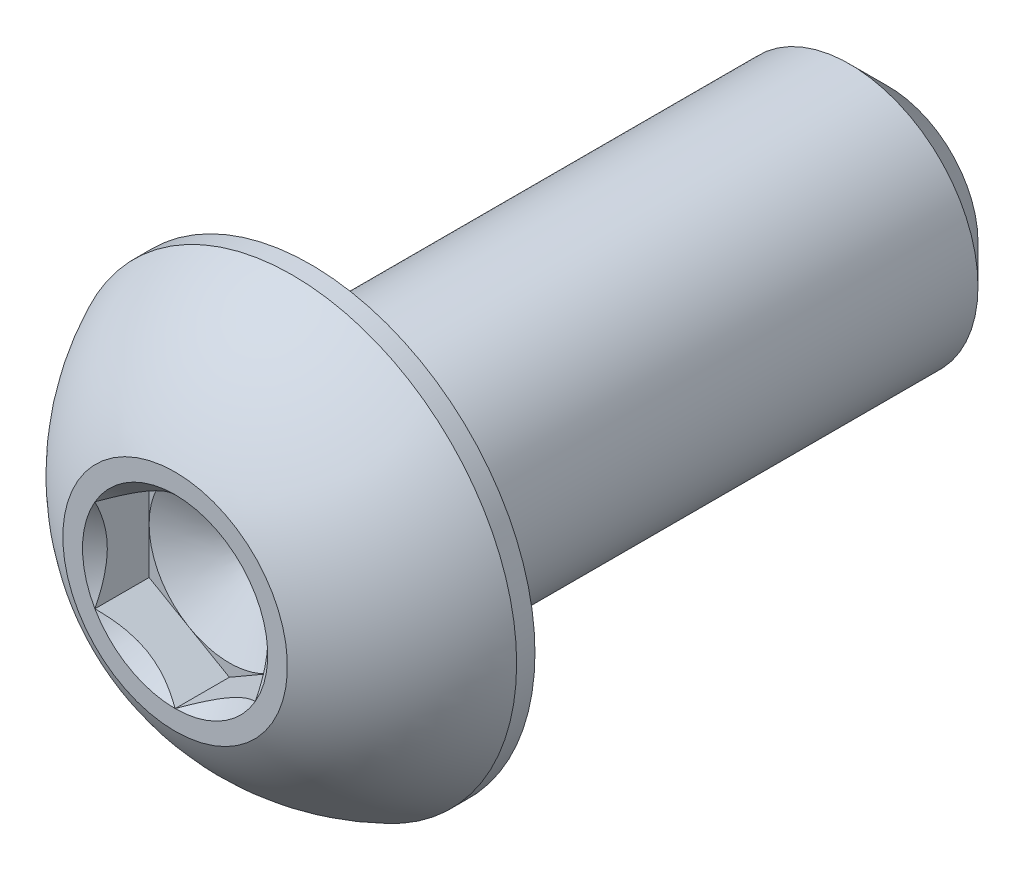
ISO-10303-21;
HEADER;
FILE_DESCRIPTION(('STEP AP214'),'2;1');
FILE_NAME('part.step','',(''),(''),'','','');
FILE_SCHEMA(('AUTOMOTIVE_DESIGN { 1 0 10303 214 1 1 1 1 }'));
ENDSEC;
DATA;
#1=APPLICATION_CONTEXT('core data for automotive mechanical design processes');
#2=APPLICATION_PROTOCOL_DEFINITION('international standard','automotive_design',2000,#1);
#3=PRODUCT_CONTEXT('',#1,'mechanical');
#4=PRODUCT('Part','Part','',(#3));
#5=PRODUCT_RELATED_PRODUCT_CATEGORY('part','',(#4));
#6=PRODUCT_DEFINITION_FORMATION('','',#4);
#7=PRODUCT_DEFINITION_CONTEXT('part definition',#1,'design');
#8=PRODUCT_DEFINITION('design','',#6,#7);
#9=PRODUCT_DEFINITION_SHAPE('','',#8);
#10=(LENGTH_UNIT() NAMED_UNIT(*) SI_UNIT(.MILLI.,.METRE.));
#11=(NAMED_UNIT(*) PLANE_ANGLE_UNIT() SI_UNIT($,.RADIAN.));
#12=(NAMED_UNIT(*) SI_UNIT($,.STERADIAN.) SOLID_ANGLE_UNIT());
#13=UNCERTAINTY_MEASURE_WITH_UNIT(LENGTH_MEASURE(1.E-05),#10,'distance_accuracy_value','');
#14=(GEOMETRIC_REPRESENTATION_CONTEXT(3) GLOBAL_UNCERTAINTY_ASSIGNED_CONTEXT((#13)) GLOBAL_UNIT_ASSIGNED_CONTEXT((#10,
#11,#12)) REPRESENTATION_CONTEXT('',''));
#15=CARTESIAN_POINT('',(0.,0.,0.));
#16=DIRECTION('',(0.,0.,1.));
#17=DIRECTION('',(1.,0.,0.));
#18=AXIS2_PLACEMENT_3D('',#15,#16,#17);
#19=CARTESIAN_POINT('',(0.,1.984375,8.82015));
#20=DIRECTION('',(0.,0.,-1.));
#21=DIRECTION('',(-1.,0.,0.));
#22=AXIS2_PLACEMENT_3D('',#19,#20,#21);
#23=PLANE('',#22);
#24=CARTESIAN_POINT('',(0.,0.,8.82015));
#25=DIRECTION('',(0.,0.,1.));
#26=DIRECTION('',(1.,0.,0.));
#27=AXIS2_PLACEMENT_3D('',#24,#25,#26);
#28=CIRCLE('',#27,2.778125);
#29=CARTESIAN_POINT('',(0.,2.778125,8.82015));
#30=VERTEX_POINT('',#29);
#31=EDGE_CURVE('E166',#30,#30,#28,.T.);
#32=ORIENTED_EDGE('',*,*,#31,.T.);
#33=EDGE_LOOP('',(#32));
#34=FACE_BOUND('',#33,.T.);
#35=CARTESIAN_POINT('',(0.,0.,8.82015));
#36=DIRECTION('',(0.,0.,1.));
#37=DIRECTION('',(1.,0.,0.));
#38=AXIS2_PLACEMENT_3D('',#35,#36,#37);
#39=CIRCLE('',#38,2.29135888084633);
#40=CARTESIAN_POINT('',(0.,2.29135888084633,8.82015));
#41=VERTEX_POINT('',#40);
#42=CARTESIAN_POINT('',(-1.984375,1.14567944042316,8.82015));
#43=VERTEX_POINT('',#42);
#44=EDGE_CURVE('E120',#41,#43,#39,.T.);
#45=ORIENTED_EDGE('',*,*,#44,.F.);
#46=CARTESIAN_POINT('',(0.,0.,8.82015));
#47=DIRECTION('',(0.,0.,1.));
#48=DIRECTION('',(1.,0.,0.));
#49=AXIS2_PLACEMENT_3D('',#46,#47,#48);
#50=CIRCLE('',#49,2.29135888084633);
#51=CARTESIAN_POINT('',(1.984375,1.14567944042316,8.82015));
#52=VERTEX_POINT('',#51);
#53=EDGE_CURVE('E105',#52,#41,#50,.T.);
#54=ORIENTED_EDGE('',*,*,#53,.F.);
#55=CARTESIAN_POINT('',(0.,0.,8.82015));
#56=DIRECTION('',(0.,0.,1.));
#57=DIRECTION('',(1.,0.,0.));
#58=AXIS2_PLACEMENT_3D('',#55,#56,#57);
#59=CIRCLE('',#58,2.29135888084633);
#60=CARTESIAN_POINT('',(1.984375,-1.14567944042316,8.82015));
#61=VERTEX_POINT('',#60);
#62=EDGE_CURVE('E116',#61,#52,#59,.T.);
#63=ORIENTED_EDGE('',*,*,#62,.F.);
#64=CARTESIAN_POINT('',(0.,0.,8.82015));
#65=DIRECTION('',(0.,0.,1.));
#66=DIRECTION('',(1.,0.,0.));
#67=AXIS2_PLACEMENT_3D('',#64,#65,#66);
#68=CIRCLE('',#67,2.29135888084633);
#69=CARTESIAN_POINT('',(0.,-2.29135888084633,8.82015));
#70=VERTEX_POINT('',#69);
#71=EDGE_CURVE('E137',#70,#61,#68,.T.);
#72=ORIENTED_EDGE('',*,*,#71,.F.);
#73=CARTESIAN_POINT('',(0.,0.,8.82015));
#74=DIRECTION('',(0.,0.,1.));
#75=DIRECTION('',(1.,0.,0.));
#76=AXIS2_PLACEMENT_3D('',#73,#74,#75);
#77=CIRCLE('',#76,2.29135888084633);
#78=CARTESIAN_POINT('',(-1.984375,-1.14567944042317,8.82015));
#79=VERTEX_POINT('',#78);
#80=EDGE_CURVE('E437',#79,#70,#77,.T.);
#81=ORIENTED_EDGE('',*,*,#80,.F.);
#82=CARTESIAN_POINT('',(0.,0.,8.82015));
#83=DIRECTION('',(0.,0.,1.));
#84=DIRECTION('',(1.,0.,0.));
#85=AXIS2_PLACEMENT_3D('',#82,#83,#84);
#86=CIRCLE('',#85,2.29135888084633);
#87=EDGE_CURVE('E446',#43,#79,#86,.T.);
#88=ORIENTED_EDGE('',*,*,#87,.F.);
#89=EDGE_LOOP('',(#45,#54,#63,#72,#81,#88));
#90=FACE_BOUND('',#89,.T.);
#91=ADVANCED_FACE('F32',(#34,#90),#23,.F.);
#92=CARTESIAN_POINT('',(0.,0.,-8.82015));
#93=DIRECTION('',(0.,0.,1.));
#94=DIRECTION('',(1.,0.,0.));
#95=AXIS2_PLACEMENT_3D('',#92,#93,#94);
#96=CONICAL_SURFACE('',#95,2.2225,0.785398163397446);
#97=CARTESIAN_POINT('',(0.,0.,-7.86765));
#98=DIRECTION('',(0.,0.,1.));
#99=DIRECTION('',(1.,0.,0.));
#100=AXIS2_PLACEMENT_3D('',#97,#98,#99);
#101=CIRCLE('',#100,3.175);
#102=CARTESIAN_POINT('',(3.175,0.,-7.86765));
#103=VERTEX_POINT('',#102);
#104=EDGE_CURVE('E11',#103,#103,#101,.T.);
#105=ORIENTED_EDGE('',*,*,#104,.F.);
#106=EDGE_LOOP('',(#105));
#107=FACE_BOUND('',#106,.T.);
#108=CARTESIAN_POINT('',(0.,0.,-8.82015));
#109=DIRECTION('',(0.,0.,1.));
#110=DIRECTION('',(1.,0.,0.));
#111=AXIS2_PLACEMENT_3D('',#108,#109,#110);
#112=CIRCLE('',#111,2.2225);
#113=CARTESIAN_POINT('',(2.2225,0.,-8.82015));
#114=VERTEX_POINT('',#113);
#115=EDGE_CURVE('E159',#114,#114,#112,.T.);
#116=ORIENTED_EDGE('',*,*,#115,.T.);
#117=EDGE_LOOP('',(#116));
#118=FACE_BOUND('',#117,.T.);
#119=ADVANCED_FACE('F34',(#107,#118),#96,.T.);
#120=CARTESIAN_POINT('',(0.,0.,8.82015));
#121=DIRECTION('',(0.,0.,1.));
#122=DIRECTION('',(1.,0.,0.));
#123=AXIS2_PLACEMENT_3D('',#120,#121,#122);
#124=CYLINDRICAL_SURFACE('',#123,3.175);
#125=CARTESIAN_POINT('',(0.,0.,5.46735));
#126=DIRECTION('',(0.,0.,1.));
#127=DIRECTION('',(1.,0.,0.));
#128=AXIS2_PLACEMENT_3D('',#125,#126,#127);
#129=CIRCLE('',#128,3.175);
#130=CARTESIAN_POINT('',(3.175,0.,5.46735));
#131=VERTEX_POINT('',#130);
#132=EDGE_CURVE('E40',#131,#131,#129,.T.);
#133=ORIENTED_EDGE('',*,*,#132,.F.);
#134=EDGE_LOOP('',(#133));
#135=FACE_BOUND('',#134,.T.);
#136=ORIENTED_EDGE('',*,*,#104,.T.);
#137=EDGE_LOOP('',(#136));
#138=FACE_BOUND('',#137,.T.);
#139=ADVANCED_FACE('F180',(#135,#138),#124,.T.);
#140=CARTESIAN_POINT('',(0.,5.5499,5.46735));
#141=DIRECTION('',(0.,0.,1.));
#142=DIRECTION('',(1.,0.,0.));
#143=AXIS2_PLACEMENT_3D('',#140,#141,#142);
#144=PLANE('',#143);
#145=CARTESIAN_POINT('',(0.,0.,5.46735));
#146=DIRECTION('',(0.,0.,1.));
#147=DIRECTION('',(1.,0.,0.));
#148=AXIS2_PLACEMENT_3D('',#145,#146,#147);
#149=CIRCLE('',#148,5.5499);
#150=CARTESIAN_POINT('',(5.5499,0.,5.46735));
#151=VERTEX_POINT('',#150);
#152=EDGE_CURVE('E173',#151,#151,#149,.T.);
#153=ORIENTED_EDGE('',*,*,#152,.F.);
#154=EDGE_LOOP('',(#153));
#155=FACE_BOUND('',#154,.T.);
#156=ORIENTED_EDGE('',*,*,#132,.T.);
#157=EDGE_LOOP('',(#156));
#158=FACE_BOUND('',#157,.T.);
#159=ADVANCED_FACE('F178',(#155,#158),#144,.F.);
#160=CARTESIAN_POINT('',(0.,0.,8.82015));
#161=DIRECTION('',(0.,0.,1.));
#162=DIRECTION('',(1.,0.,0.));
#163=AXIS2_PLACEMENT_3D('',#160,#161,#162);
#164=CYLINDRICAL_SURFACE('',#163,5.5499);
#165=CARTESIAN_POINT('',(0.,0.,5.92092142857143));
#166=DIRECTION('',(0.,0.,1.));
#167=DIRECTION('',(1.,0.,0.));
#168=AXIS2_PLACEMENT_3D('',#165,#166,#167);
#169=CIRCLE('',#168,5.5499);
#170=CARTESIAN_POINT('',(0.,5.5499,5.92092142857143));
#171=VERTEX_POINT('',#170);
#172=EDGE_CURVE('E170',#171,#171,#169,.T.);
#173=ORIENTED_EDGE('',*,*,#172,.F.);
#174=EDGE_LOOP('',(#173));
#175=FACE_BOUND('',#174,.T.);
#176=ORIENTED_EDGE('',*,*,#152,.T.);
#177=EDGE_LOOP('',(#176));
#178=FACE_BOUND('',#177,.T.);
#179=ADVANCED_FACE('F199',(#175,#178),#164,.T.);
#180=CARTESIAN_POINT('',(0.,0.,3.38957820685455));
#181=DIRECTION('',(0.,0.,1.));
#182=DIRECTION('',(0.,1.,0.));
#183=AXIS2_PLACEMENT_3D('',#180,#181,#182);
#184=SPHERICAL_SURFACE('',#183,6.09992528775001);
#185=CARTESIAN_POINT('',(0.,2.778125,8.82015));
#186=CARTESIAN_POINT('',(0.,2.81602671338564,8.80076064772217));
#187=CARTESIAN_POINT('',(0.,2.85372537445918,8.78097438218914));
#188=CARTESIAN_POINT('',(0.,2.92870021164798,8.7406169699155));
#189=CARTESIAN_POINT('',(0.,2.96597638776324,8.72004582317489));
#190=CARTESIAN_POINT('',(0.,3.04008987470139,8.67812759378889));
#191=CARTESIAN_POINT('',(0.,3.07692718552427,8.65678051114351));
#192=CARTESIAN_POINT('',(0.,3.15014680356086,8.61331978760221));
#193=CARTESIAN_POINT('',(0.,3.18652911077458,8.5912061467063));
#194=CARTESIAN_POINT('',(0.,3.25882276944387,8.54622199565968));
#195=CARTESIAN_POINT('',(0.,3.29473412089945,8.52335148550896));
#196=CARTESIAN_POINT('',(0.,3.36607012592493,8.47686362336544));
#197=CARTESIAN_POINT('',(0.,3.40149477949484,8.45324627137262));
#198=CARTESIAN_POINT('',(0.,3.47184185902622,8.40527507858578));
#199=CARTESIAN_POINT('',(0.,3.50676428498768,8.38092123779175));
#200=CARTESIAN_POINT('',(0.,3.57609160000261,8.33148774378183));
#201=CARTESIAN_POINT('',(0.,3.61049648905608,8.30640809056595));
#202=CARTESIAN_POINT('',(0.,3.67877364776563,8.25553396614725));
#203=CARTESIAN_POINT('',(0.,3.71264591742172,8.22973949494445));
#204=CARTESIAN_POINT('',(0.,3.77984298835613,8.17744704238411));
#205=CARTESIAN_POINT('',(0.,3.81316778963445,8.15094906102658));
#206=CARTESIAN_POINT('',(0.,3.87925531482814,8.09726120438586));
#207=CARTESIAN_POINT('',(0.,3.91201803874352,8.07007132910267));
#208=CARTESIAN_POINT('',(0.,3.97696704663191,8.01501160415578));
#209=CARTESIAN_POINT('',(0.,4.00915333060493,7.98714175449209));
#210=CARTESIAN_POINT('',(0.,4.07293534872958,7.93073429841706));
#211=CARTESIAN_POINT('',(0.,4.10453108288122,7.90219669200573));
#212=CARTESIAN_POINT('',(0.,4.16711815037044,7.84446623280081));
#213=CARTESIAN_POINT('',(0.,4.19810948370803,7.81527338000723));
#214=CARTESIAN_POINT('',(0.,4.25947416353471,7.75624522565121));
#215=CARTESIAN_POINT('',(0.,4.28984751002382,7.72640992408876));
#216=CARTESIAN_POINT('',(0.,4.34996290103328,7.66610995144623));
#217=CARTESIAN_POINT('',(0.,4.37970494555363,7.63564528036614));
#218=CARTESIAN_POINT('',(0.,4.43854469425657,7.57409992384361));
#219=CARTESIAN_POINT('',(0.,4.46764239843916,7.54301923840117));
#220=CARTESIAN_POINT('',(0.,4.52518071056457,7.48025547835869));
#221=CARTESIAN_POINT('',(0.,4.55362131850739,7.44857240375865));
#222=CARTESIAN_POINT('',(0.,4.60983297031029,7.38461775468213));
#223=CARTESIAN_POINT('',(0.,4.63760401417036,7.35234618020565));
#224=CARTESIAN_POINT('',(0.,4.6924643634894,7.28722867864499));
#225=CARTESIAN_POINT('',(0.,4.71955366894839,7.25438275156081));
#226=CARTESIAN_POINT('',(0.,4.77303866600855,7.18813094383918));
#227=CARTESIAN_POINT('',(0.,4.79943435760973,7.15472506320173));
#228=CARTESIAN_POINT('',(0.,4.85152055556542,7.08736799290146));
#229=CARTESIAN_POINT('',(0.,4.87721106191992,7.05341680323865));
#230=CARTESIAN_POINT('',(0.,4.927875627133,6.98498399846878));
#231=CARTESIAN_POINT('',(0.,4.95284968599158,6.95050238336172));
#232=CARTESIAN_POINT('',(0.,5.00207040804361,6.88102384381449));
#233=CARTESIAN_POINT('',(0.,5.02631707123706,6.84602691937432));
#234=CARTESIAN_POINT('',(0.,5.0740723726572,6.77553310316971));
#235=CARTESIAN_POINT('',(0.,5.09758101088389,6.74003621140527));
#236=CARTESIAN_POINT('',(0.,5.1438499566405,6.6685580217543));
#237=CARTESIAN_POINT('',(0.,5.16661026417041,6.63257672386778));
#238=CARTESIAN_POINT('',(0.,5.21137257072764,6.56014549546688));
#239=CARTESIAN_POINT('',(0.,5.23337456975495,6.5236955649525));
#240=CARTESIAN_POINT('',(0.,5.276610614416,6.45034305046432));
#241=CARTESIAN_POINT('',(0.,5.29784466004975,6.41344046649051));
#242=CARTESIAN_POINT('',(0.,5.33953548787471,6.33919882181283));
#243=CARTESIAN_POINT('',(0.,5.35999227006592,6.30185976110895));
#244=CARTESIAN_POINT('',(0.,5.40011960846765,6.22676153430598));
#245=CARTESIAN_POINT('',(0.,5.41979016467818,6.18900236820688));
#246=CARTESIAN_POINT('',(0.,5.45833640797136,6.11308047394067));
#247=CARTESIAN_POINT('',(0.,5.47721209505402,6.07491774577356));
#248=CARTESIAN_POINT('',(0.,5.5141603997322,5.99820549304741));
#249=CARTESIAN_POINT('',(0.,5.53223301732771,5.95965596848837));
#250=CARTESIAN_POINT('',(0.,5.5499,5.92092142857143));
#251=B_SPLINE_CURVE_WITH_KNOTS('',3,(#185,#186,#187,#188,#189,#190,#191,#192,#193,#194,#195,
#196,#197,#198,#199,#200,#201,#202,#203,#204,#205,#206,#207,#208,#209,#210,#211,#212,#213,#214,
#215,#216,#217,#218,#219,#220,#221,#222,#223,#224,#225,#226,#227,#228,#229,#230,#231,#232,#233,
#234,#235,#236,#237,#238,#239,#240,#241,#242,#243,#244,#245,#246,#247,#248,#249,#250),
.UNSPECIFIED.,.F.,.F.,(4,2,2,2,2,2,2,2,2,2,2,2,2,2,2,2,2,2,2,2,2,2,2,2,2,2,2,2,2,2,2,2,4),(0.,
0.127717597491554,0.255435194983107,0.383152792474663,0.510870389966216,0.638587987457771,
0.766305584949325,0.894023182440879,1.02174077993243,1.14945837742399,1.27717597491554,
1.4048935724071,1.53261116989865,1.6603287673902,1.78804636488176,1.91576396237331,
2.04348155986487,2.17119915735642,2.29891675484797,2.42663435233953,2.55435194983108,
2.68206954732263,2.80978714481419,2.93750474230574,3.0652223397973,3.19293993728885,
3.32065753478041,3.44837513227196,3.57609272976351,3.70381032725507,3.83152792474662,
3.95924552223818,4.08696311972973),.UNSPECIFIED.);
#252=EDGE_CURVE('BSEAM191',#30,#171,#251,.T.);
#253=ORIENTED_EDGE('',*,*,#31,.F.);
#254=ORIENTED_EDGE('',*,*,#172,.T.);
#255=ORIENTED_EDGE('',*,*,#252,.T.);
#256=ORIENTED_EDGE('',*,*,#252,.F.);
#257=EDGE_LOOP('',(#253,#255,#254,#256));
#258=FACE_BOUND('',#257,.T.);
#259=ADVANCED_FACE('F191',(#258),#184,.T.);
#260=CARTESIAN_POINT('',(0.,2.2225,-8.82015));
#261=DIRECTION('',(0.,0.,1.));
#262=DIRECTION('',(1.,0.,0.));
#263=AXIS2_PLACEMENT_3D('',#260,#261,#262);
#264=PLANE('',#263);
#265=ORIENTED_EDGE('',*,*,#115,.F.);
#266=EDGE_LOOP('',(#265));
#267=FACE_BOUND('',#266,.T.);
#268=ADVANCED_FACE('F189',(#267),#264,.F.);
#269=CARTESIAN_POINT('',(1.984375,1.14567944042316,8.82015));
#270=DIRECTION('',(-0.499999999999999,-0.866025403784439,0.));
#271=DIRECTION('',(0.866025403784439,-0.499999999999999,0.));
#272=AXIS2_PLACEMENT_3D('',#269,#270,#271);
#273=PLANE('',#272);
#274=CARTESIAN_POINT('',(1.984575,1.14556397036933,8.82026547878184));
#275=CARTESIAN_POINT('',(1.9163590048332,1.18494849354192,8.78091285226391));
#276=CARTESIAN_POINT('',(1.84700231489303,1.22499159714897,8.74387131044618));
#277=CARTESIAN_POINT('',(1.70557619954781,1.30664400291398,8.67604885842332));
#278=CARTESIAN_POINT('',(1.63349332126322,1.34826107209555,8.64530568909175));
#279=CARTESIAN_POINT('',(1.488141602734,1.43217992591557,8.59264188881121));
#280=CARTESIAN_POINT('',(1.41490978751306,1.47446033414663,8.57058887587996));
#281=CARTESIAN_POINT('',(1.26683381740529,1.55995203534886,8.53661149294388));
#282=CARTESIAN_POINT('',(1.19199418724658,1.60316071596705,8.52466175609173));
#283=CARTESIAN_POINT('',(1.06301458545618,1.6776271237807,8.5138800990819));
#284=CARTESIAN_POINT('',(1.00904128422756,1.7087886237741,8.51228389905907));
#285=CARTESIAN_POINT('',(0.901182881480199,1.77106070163465,8.51497183886529));
#286=CARTESIAN_POINT('',(0.847297817514476,1.80217125782056,8.51925804034046));
#287=CARTESIAN_POINT('',(0.740036461751395,1.86409863044402,8.53346687301352));
#288=CARTESIAN_POINT('',(0.686660807239859,1.89491507894443,8.54339581045227));
#289=CARTESIAN_POINT('',(0.580832482591103,1.95601509066828,8.56834508427454));
#290=CARTESIAN_POINT('',(0.528379742028898,1.9862986945516,8.58336503038949));
#291=CARTESIAN_POINT('',(0.394017661036351,2.06387267818152,8.62795785163567));
#292=CARTESIAN_POINT('',(0.312941642841675,2.11068193911104,8.66089299593833));
#293=CARTESIAN_POINT('',(0.19372669327016,2.17951072233758,8.7164924412022));
#294=CARTESIAN_POINT('',(0.154440075613999,2.20219286161692,8.73602759205186));
#295=CARTESIAN_POINT('',(0.0765946381319467,2.24713694590237,8.7768787381194));
#296=CARTESIAN_POINT('',(0.0380353888983009,2.26939913882716,8.79819363956835));
#297=CARTESIAN_POINT('',(-0.000200000000000698,2.29147435090016,8.82026547878184));
#298=B_SPLINE_CURVE_WITH_KNOTS('',3,(#274,#275,#276,#277,#278,#279,#280,#281,#282,#283,#284,
#285,#286,#287,#288,#289,#290,#291,#292,#293,#294,#295,#296,#297),.UNSPECIFIED.,.F.,.F.,(4,2,2,
2,2,2,2,2,2,2,2,4),(0.,0.264339630306628,0.530219665093695,0.791876416371461,1.05287424418109,
1.239639843932,1.42647091743852,1.61351120244035,1.8005371524754,2.09764209964316,
2.24579179873714,2.39385111134157),.UNSPECIFIED.);
#299=EDGE_CURVE('E102',#52,#41,#298,.T.);
#300=ORIENTED_EDGE('',*,*,#299,.T.);
#301=DIRECTION('',(0.,0.,-1.));
#302=VECTOR('',#301,1.);
#303=CARTESIAN_POINT('',(0.,2.29135888084633,8.82015));
#304=LINE('',#303,#302);
#305=CARTESIAN_POINT('',(0.,2.29135888084633,7.47903));
#306=VERTEX_POINT('',#305);
#307=EDGE_CURVE('E157',#41,#306,#304,.T.);
#308=ORIENTED_EDGE('',*,*,#307,.T.);
#309=DIRECTION('',(-0.866025403784439,0.499999999999999,0.));
#310=VECTOR('',#309,1.);
#311=CARTESIAN_POINT('',(1.984375,1.14567944042316,7.47903));
#312=LINE('',#311,#310);
#313=CARTESIAN_POINT('',(0.992187499999998,1.71851916063475,7.47903));
#314=VERTEX_POINT('',#313);
#315=EDGE_CURVE('E473',#314,#306,#312,.T.);
#316=ORIENTED_EDGE('',*,*,#315,.F.);
#317=CARTESIAN_POINT('',(1.984375,1.14567944042316,7.47903));
#318=VERTEX_POINT('',#317);
#319=EDGE_CURVE('E47',#318,#314,#312,.T.);
#320=ORIENTED_EDGE('',*,*,#319,.F.);
#321=DIRECTION('',(0.,0.,-1.));
#322=VECTOR('',#321,1.);
#323=CARTESIAN_POINT('',(1.984375,1.14567944042316,8.82015));
#324=LINE('',#323,#322);
#325=EDGE_CURVE('E133',#52,#318,#324,.T.);
#326=ORIENTED_EDGE('',*,*,#325,.F.);
#327=EDGE_LOOP('',(#300,#308,#316,#320,#326));
#328=FACE_BOUND('',#327,.T.);
#329=ADVANCED_FACE('F139',(#328),#273,.T.);
#330=CARTESIAN_POINT('',(0.,2.29135888084633,8.82015));
#331=DIRECTION('',(0.5,-0.866025403784438,0.));
#332=DIRECTION('',(0.866025403784438,0.5,0.));
#333=AXIS2_PLACEMENT_3D('',#330,#331,#332);
#334=PLANE('',#333);
#335=CARTESIAN_POINT('',(0.000199999999999143,2.29147435090016,8.82026547878184));
#336=CARTESIAN_POINT('',(-0.068015995166803,2.25208982772757,8.78091285226391));
#337=CARTESIAN_POINT('',(-0.137372685106966,2.21204672412052,8.74387131044618));
#338=CARTESIAN_POINT('',(-0.278798800452188,2.13039431835551,8.67604885842332));
#339=CARTESIAN_POINT('',(-0.350881678736783,2.08877724917394,8.64530568909175));
#340=CARTESIAN_POINT('',(-0.496233397266004,2.00485839535392,8.59264188881121));
#341=CARTESIAN_POINT('',(-0.569465212486939,1.96257798712287,8.57058887587996));
#342=CARTESIAN_POINT('',(-0.717541182594706,1.87708628592063,8.53661149294387));
#343=CARTESIAN_POINT('',(-0.792380812753424,1.83387760530244,8.52466175609173));
#344=CARTESIAN_POINT('',(-0.921360414543815,1.75941119748879,8.5138800990819));
#345=CARTESIAN_POINT('',(-0.975333715772442,1.72824969749539,8.51228389905907));
#346=CARTESIAN_POINT('',(-1.0831921185198,1.66597761963484,8.51497183886529));
#347=CARTESIAN_POINT('',(-1.13707718248552,1.63486706344893,8.51925804034046));
#348=CARTESIAN_POINT('',(-1.2443385382486,1.57293969082547,8.53346687301352));
#349=CARTESIAN_POINT('',(-1.29771419276014,1.54212324232506,8.54339581045227));
#350=CARTESIAN_POINT('',(-1.4035425174089,1.48102323060122,8.56834508427454));
#351=CARTESIAN_POINT('',(-1.4559952579711,1.45073962671789,8.58336503038949));
#352=CARTESIAN_POINT('',(-1.59035733896365,1.37316564308797,8.62795785163567));
#353=CARTESIAN_POINT('',(-1.67143335715832,1.32635638215845,8.66089299593833));
#354=CARTESIAN_POINT('',(-1.79064830672984,1.25752759893191,8.7164924412022));
#355=CARTESIAN_POINT('',(-1.829934924386,1.23484545965257,8.73602759205186));
#356=CARTESIAN_POINT('',(-1.90778036186805,1.18990137536712,8.7768787381194));
#357=CARTESIAN_POINT('',(-1.9463396111017,1.16763918244233,8.79819363956835));
#358=CARTESIAN_POINT('',(-1.984575,1.14556397036932,8.82026547878184));
#359=B_SPLINE_CURVE_WITH_KNOTS('',3,(#335,#336,#337,#338,#339,#340,#341,#342,#343,#344,#345,
#346,#347,#348,#349,#350,#351,#352,#353,#354,#355,#356,#357,#358),.UNSPECIFIED.,.F.,.F.,(4,2,2,
2,2,2,2,2,2,2,2,4),(0.,0.264339630306627,0.530219665093694,0.79187641637146,1.05287424418109,
1.239639843932,1.42647091743852,1.61351120244035,1.8005371524754,2.09764209964316,
2.24579179873714,2.39385111134157),.UNSPECIFIED.);
#360=EDGE_CURVE('E461',#41,#43,#359,.T.);
#361=ORIENTED_EDGE('',*,*,#360,.T.);
#362=DIRECTION('',(0.,0.,-1.));
#363=VECTOR('',#362,1.);
#364=CARTESIAN_POINT('',(-1.984375,1.14567944042316,8.82015));
#365=LINE('',#364,#363);
#366=CARTESIAN_POINT('',(-1.984375,1.14567944042316,7.47903));
#367=VERTEX_POINT('',#366);
#368=EDGE_CURVE('E154',#43,#367,#365,.T.);
#369=ORIENTED_EDGE('',*,*,#368,.T.);
#370=DIRECTION('',(-0.866025403784438,-0.5,0.));
#371=VECTOR('',#370,1.);
#372=CARTESIAN_POINT('',(0.,2.29135888084633,7.47903));
#373=LINE('',#372,#371);
#374=CARTESIAN_POINT('',(-0.9921875,1.71851916063474,7.47903));
#375=VERTEX_POINT('',#374);
#376=EDGE_CURVE('E475',#375,#367,#373,.T.);
#377=ORIENTED_EDGE('',*,*,#376,.F.);
#378=EDGE_CURVE('E476',#306,#375,#373,.T.);
#379=ORIENTED_EDGE('',*,*,#378,.F.);
#380=ORIENTED_EDGE('',*,*,#307,.F.);
#381=EDGE_LOOP('',(#361,#369,#377,#379,#380));
#382=FACE_BOUND('',#381,.T.);
#383=ADVANCED_FACE('F197',(#382),#334,.T.);
#384=CARTESIAN_POINT('',(-1.984375,1.14567944042316,8.82015));
#385=DIRECTION('',(1.,0.,0.));
#386=DIRECTION('',(0.,0.,-1.));
#387=AXIS2_PLACEMENT_3D('',#384,#385,#386);
#388=PLANE('',#387);
#389=CARTESIAN_POINT('',(-1.984375,-2.24664989492636,9.52632008331692));
#390=CARTESIAN_POINT('',(-1.984375,-2.19177035879913,9.48519669928858));
#391=CARTESIAN_POINT('',(-1.984375,-2.1365793309425,9.4444829661326));
#392=CARTESIAN_POINT('',(-1.984375,-2.0254530694156,9.36405486706175));
#393=CARTESIAN_POINT('',(-1.984375,-1.96951764844329,9.3243407602265));
#394=CARTESIAN_POINT('',(-1.984375,-1.85637247000972,9.24580999604986));
#395=CARTESIAN_POINT('',(-1.984375,-1.79915619451492,9.20700268502025));
#396=CARTESIAN_POINT('',(-1.984375,-1.68374612486123,9.13088116655778));
#397=CARTESIAN_POINT('',(-1.984375,-1.62555240093273,9.09356685249807));
#398=CARTESIAN_POINT('',(-1.984375,-1.44283684202776,8.98031794235897));
#399=CARTESIAN_POINT('',(-1.984375,-1.31636516124235,8.90747141910061));
#400=CARTESIAN_POINT('',(-1.984375,-1.05716498260296,8.77446175577765));
#401=CARTESIAN_POINT('',(-1.984375,-0.924459462264122,8.71425591965465));
#402=CARTESIAN_POINT('',(-1.984375,-0.724893074141588,8.64061183961541));
#403=CARTESIAN_POINT('',(-1.984375,-0.660907572248813,8.61941291748557));
#404=CARTESIAN_POINT('',(-1.984375,-0.531425551080247,8.58215711479737));
#405=CARTESIAN_POINT('',(-1.984375,-0.465928924835295,8.56610059946328));
#406=CARTESIAN_POINT('',(-1.984375,-0.334891945890406,8.54022084345925));
#407=CARTESIAN_POINT('',(-1.984375,-0.269372555502921,8.53029310154836));
#408=CARTESIAN_POINT('',(-1.984375,-0.137675185771462,8.51685859031056));
#409=CARTESIAN_POINT('',(-1.984375,-0.0714973135780639,8.51335079294676));
#410=CARTESIAN_POINT('',(-1.984375,0.0586431546448471,8.51300164823735));
#411=CARTESIAN_POINT('',(-1.984375,0.122605247687118,8.51593962459112));
#412=CARTESIAN_POINT('',(-1.984375,0.249962419599663,8.52784170918258));
#413=CARTESIAN_POINT('',(-1.984375,0.31335744162457,8.53680641485244));
#414=CARTESIAN_POINT('',(-1.984375,0.440194078343454,8.56043115034761));
#415=CARTESIAN_POINT('',(-1.984375,0.503617615772963,8.57518679973638));
#416=CARTESIAN_POINT('',(-1.984375,0.629083701047628,8.6096207574727));
#417=CARTESIAN_POINT('',(-1.984375,0.691126376772748,8.62929860789798));
#418=CARTESIAN_POINT('',(-1.984375,0.888252191671363,8.69917518633261));
#419=CARTESIAN_POINT('',(-1.984375,1.02048040542615,8.75740558934036));
#420=CARTESIAN_POINT('',(-1.984375,1.27871806100267,8.88681918027672));
#421=CARTESIAN_POINT('',(-1.984375,1.40470281207756,8.95804927195745));
#422=CARTESIAN_POINT('',(-1.984375,1.5867785992022,9.06916293194116));
#423=CARTESIAN_POINT('',(-1.984375,1.64484387516129,9.10587382489262));
#424=CARTESIAN_POINT('',(-1.984375,1.75997827817988,9.18083744763746));
#425=CARTESIAN_POINT('',(-1.984375,1.81704732901584,9.21909029467485));
#426=CARTESIAN_POINT('',(-1.984375,1.92985499213404,9.29653678199377));
#427=CARTESIAN_POINT('',(-1.984375,1.98560066211377,9.33572019322867));
#428=CARTESIAN_POINT('',(-1.984375,2.09633159947627,9.41511660992608));
#429=CARTESIAN_POINT('',(-1.984375,2.15131707145809,9.4553293297131));
#430=CARTESIAN_POINT('',(-1.984375,2.20598450458982,9.49596347260997));
#431=B_SPLINE_CURVE_WITH_KNOTS('',3,(#389,#390,#391,#392,#393,#394,#395,#396,#397,#398,#399,
#400,#401,#402,#403,#404,#405,#406,#407,#408,#409,#410,#411,#412,#413,#414,#415,#416,#417,#418,
#419,#420,#421,#422,#423,#424,#425,#426,#427,#428,#429,#430),.UNSPECIFIED.,.F.,.F.,(4,2,2,2,2,2,
2,2,2,2,2,2,2,2,2,2,2,2,2,2,4),(0.,0.205736210356764,0.411525204809809,0.618909845914796,
0.826279649489809,1.26374370453551,1.69970549535382,1.90175047418286,2.10380979948048,
2.3023211047986,2.50080061937433,2.69259135253523,2.88440110079442,3.07952109080018,
3.27462293514803,3.70679897011889,4.14056631296021,4.34663769336143,4.55272477227101,
4.7571295110882,4.96147812147718),.UNSPECIFIED.);
#432=EDGE_CURVE('E454',#43,#79,#431,.F.);
#433=ORIENTED_EDGE('',*,*,#432,.T.);
#434=DIRECTION('',(0.,0.,-1.));
#435=VECTOR('',#434,1.);
#436=CARTESIAN_POINT('',(-1.984375,-1.14567944042316,8.82015));
#437=LINE('',#436,#435);
#438=CARTESIAN_POINT('',(-1.984375,-1.14567944042316,7.47903));
#439=VERTEX_POINT('',#438);
#440=EDGE_CURVE('E151',#79,#439,#437,.T.);
#441=ORIENTED_EDGE('',*,*,#440,.T.);
#442=DIRECTION('',(0.,-1.,0.));
#443=VECTOR('',#442,1.);
#444=CARTESIAN_POINT('',(-1.984375,1.14567944042316,7.47903));
#445=LINE('',#444,#443);
#446=CARTESIAN_POINT('',(-1.984375,0.,7.47903));
#447=VERTEX_POINT('',#446);
#448=EDGE_CURVE('E479',#447,#439,#445,.T.);
#449=ORIENTED_EDGE('',*,*,#448,.F.);
#450=EDGE_CURVE('E480',#367,#447,#445,.T.);
#451=ORIENTED_EDGE('',*,*,#450,.F.);
#452=ORIENTED_EDGE('',*,*,#368,.F.);
#453=EDGE_LOOP('',(#433,#441,#449,#451,#452));
#454=FACE_BOUND('',#453,.T.);
#455=ADVANCED_FACE('F318',(#454),#388,.T.);
#456=CARTESIAN_POINT('',(-1.984375,-1.14567944042316,8.82015));
#457=DIRECTION('',(0.499999999999999,0.866025403784439,0.));
#458=DIRECTION('',(-0.866025403784439,0.499999999999999,0.));
#459=AXIS2_PLACEMENT_3D('',#456,#457,#458);
#460=PLANE('',#459);
#461=CARTESIAN_POINT('',(-1.984575,-1.14556397036933,8.82026547878184));
#462=CARTESIAN_POINT('',(-1.9163590048332,-1.18494849354192,8.78091285226391));
#463=CARTESIAN_POINT('',(-1.84700231489303,-1.22499159714897,8.74387131044618));
#464=CARTESIAN_POINT('',(-1.70557619954781,-1.30664400291398,8.67604885842332));
#465=CARTESIAN_POINT('',(-1.63349332126322,-1.34826107209555,8.64530568909175));
#466=CARTESIAN_POINT('',(-1.488141602734,-1.43217992591557,8.59264188881121));
#467=CARTESIAN_POINT('',(-1.41490978751306,-1.47446033414663,8.57058887587996));
#468=CARTESIAN_POINT('',(-1.26683381740529,-1.55995203534886,8.53661149294388));
#469=CARTESIAN_POINT('',(-1.19199418724658,-1.60316071596705,8.52466175609173));
#470=CARTESIAN_POINT('',(-1.06301458545618,-1.6776271237807,8.51388009908191));
#471=CARTESIAN_POINT('',(-1.00904128422756,-1.7087886237741,8.51228389905907));
#472=CARTESIAN_POINT('',(-0.901182881480199,-1.77106070163465,8.51497183886529));
#473=CARTESIAN_POINT('',(-0.847297817514476,-1.80217125782056,8.51925804034046));
#474=CARTESIAN_POINT('',(-0.740036461751396,-1.86409863044402,8.53346687301352));
#475=CARTESIAN_POINT('',(-0.686660807239859,-1.89491507894443,8.54339581045227));
#476=CARTESIAN_POINT('',(-0.580832482591103,-1.95601509066827,8.56834508427454));
#477=CARTESIAN_POINT('',(-0.528379742028898,-1.9862986945516,8.58336503038949));
#478=CARTESIAN_POINT('',(-0.394017661036351,-2.06387267818152,8.62795785163567));
#479=CARTESIAN_POINT('',(-0.312941642841675,-2.11068193911104,8.66089299593833));
#480=CARTESIAN_POINT('',(-0.193726693270159,-2.17951072233758,8.7164924412022));
#481=CARTESIAN_POINT('',(-0.154440075613997,-2.20219286161692,8.73602759205186));
#482=CARTESIAN_POINT('',(-0.0765946381319451,-2.24713694590237,8.7768787381194));
#483=CARTESIAN_POINT('',(-0.0380353888982991,-2.26939913882716,8.79819363956835));
#484=CARTESIAN_POINT('',(0.000200000000002669,-2.29147435090017,8.82026547878184));
#485=B_SPLINE_CURVE_WITH_KNOTS('',3,(#461,#462,#463,#464,#465,#466,#467,#468,#469,#470,#471,
#472,#473,#474,#475,#476,#477,#478,#479,#480,#481,#482,#483,#484),.UNSPECIFIED.,.F.,.F.,(4,2,2,
2,2,2,2,2,2,2,2,4),(0.,0.264339630306627,0.530219665093694,0.79187641637146,1.05287424418109,
1.239639843932,1.42647091743852,1.61351120244035,1.8005371524754,2.09764209964316,
2.24579179873714,2.39385111134157),.UNSPECIFIED.);
#486=EDGE_CURVE('E439',#79,#70,#485,.T.);
#487=ORIENTED_EDGE('',*,*,#486,.T.);
#488=DIRECTION('',(0.,0.,-1.));
#489=VECTOR('',#488,1.);
#490=CARTESIAN_POINT('',(0.,-2.29135888084633,8.82015));
#491=LINE('',#490,#489);
#492=CARTESIAN_POINT('',(0.,-2.29135888084633,7.47903));
#493=VERTEX_POINT('',#492);
#494=EDGE_CURVE('E142',#70,#493,#491,.T.);
#495=ORIENTED_EDGE('',*,*,#494,.T.);
#496=DIRECTION('',(0.866025403784439,-0.499999999999999,0.));
#497=VECTOR('',#496,1.);
#498=CARTESIAN_POINT('',(-1.984375,-1.14567944042316,7.47903));
#499=LINE('',#498,#497);
#500=CARTESIAN_POINT('',(-0.992187499999999,-1.71851916063475,7.47903));
#501=VERTEX_POINT('',#500);
#502=EDGE_CURVE('E483',#501,#493,#499,.T.);
#503=ORIENTED_EDGE('',*,*,#502,.F.);
#504=EDGE_CURVE('E484',#439,#501,#499,.T.);
#505=ORIENTED_EDGE('',*,*,#504,.F.);
#506=ORIENTED_EDGE('',*,*,#440,.F.);
#507=EDGE_LOOP('',(#487,#495,#503,#505,#506));
#508=FACE_BOUND('',#507,.T.);
#509=ADVANCED_FACE('F328',(#508),#460,.T.);
#510=CARTESIAN_POINT('',(0.,-2.29135888084633,8.82015));
#511=DIRECTION('',(-0.5,0.866025403784438,0.));
#512=DIRECTION('',(-0.866025403784438,-0.5,0.));
#513=AXIS2_PLACEMENT_3D('',#510,#511,#512);
#514=PLANE('',#513);
#515=CARTESIAN_POINT('',(-0.00019999999999808,-2.29147435090017,8.82026547878184));
#516=CARTESIAN_POINT('',(0.068015995166804,-2.25208982772757,8.78091285226391));
#517=CARTESIAN_POINT('',(0.137372685106967,-2.21204672412052,8.74387131044618));
#518=CARTESIAN_POINT('',(0.278798800452189,-2.13039431835551,8.67604885842332));
#519=CARTESIAN_POINT('',(0.350881678736784,-2.08877724917394,8.64530568909175));
#520=CARTESIAN_POINT('',(0.496233397266005,-2.00485839535392,8.59264188881121));
#521=CARTESIAN_POINT('',(0.569465212486939,-1.96257798712287,8.57058887587996));
#522=CARTESIAN_POINT('',(0.717541182594706,-1.87708628592063,8.53661149294388));
#523=CARTESIAN_POINT('',(0.792380812753425,-1.83387760530244,8.52466175609173));
#524=CARTESIAN_POINT('',(0.921360414543815,-1.75941119748879,8.51388009908191));
#525=CARTESIAN_POINT('',(0.975333715772442,-1.72824969749539,8.51228389905907));
#526=CARTESIAN_POINT('',(1.0831921185198,-1.66597761963484,8.51497183886529));
#527=CARTESIAN_POINT('',(1.13707718248552,-1.63486706344893,8.51925804034046));
#528=CARTESIAN_POINT('',(1.2443385382486,-1.57293969082547,8.53346687301352));
#529=CARTESIAN_POINT('',(1.29771419276014,-1.54212324232506,8.54339581045227));
#530=CARTESIAN_POINT('',(1.4035425174089,-1.48102323060122,8.56834508427454));
#531=CARTESIAN_POINT('',(1.4559952579711,-1.45073962671789,8.58336503038949));
#532=CARTESIAN_POINT('',(1.59035733896365,-1.37316564308797,8.62795785163567));
#533=CARTESIAN_POINT('',(1.67143335715833,-1.32635638215845,8.66089299593833));
#534=CARTESIAN_POINT('',(1.79064830672984,-1.25752759893191,8.7164924412022));
#535=CARTESIAN_POINT('',(1.829934924386,-1.23484545965257,8.73602759205186));
#536=CARTESIAN_POINT('',(1.90778036186805,-1.18990137536713,8.7768787381194));
#537=CARTESIAN_POINT('',(1.9463396111017,-1.16763918244233,8.79819363956835));
#538=CARTESIAN_POINT('',(1.984575,-1.14556397036933,8.82026547878184));
#539=B_SPLINE_CURVE_WITH_KNOTS('',3,(#515,#516,#517,#518,#519,#520,#521,#522,#523,#524,#525,
#526,#527,#528,#529,#530,#531,#532,#533,#534,#535,#536,#537,#538),.UNSPECIFIED.,.F.,.F.,(4,2,2,
2,2,2,2,2,2,2,2,4),(0.,0.264339630306627,0.530219665093694,0.791876416371459,1.05287424418109,
1.239639843932,1.42647091743852,1.61351120244034,1.8005371524754,2.09764209964316,
2.24579179873714,2.39385111134157),.UNSPECIFIED.);
#540=EDGE_CURVE('E430',#70,#61,#539,.T.);
#541=ORIENTED_EDGE('',*,*,#540,.T.);
#542=DIRECTION('',(0.,0.,-1.));
#543=VECTOR('',#542,1.);
#544=CARTESIAN_POINT('',(1.984375,-1.14567944042316,8.82015));
#545=LINE('',#544,#543);
#546=CARTESIAN_POINT('',(1.984375,-1.14567944042316,7.47903));
#547=VERTEX_POINT('',#546);
#548=EDGE_CURVE('E136',#61,#547,#545,.T.);
#549=ORIENTED_EDGE('',*,*,#548,.T.);
#550=DIRECTION('',(0.866025403784438,0.5,0.));
#551=VECTOR('',#550,1.);
#552=CARTESIAN_POINT('',(0.,-2.29135888084633,7.47903));
#553=LINE('',#552,#551);
#554=CARTESIAN_POINT('',(0.992187500000001,-1.71851916063475,7.47903));
#555=VERTEX_POINT('',#554);
#556=EDGE_CURVE('E486',#555,#547,#553,.T.);
#557=ORIENTED_EDGE('',*,*,#556,.F.);
#558=EDGE_CURVE('E487',#493,#555,#553,.T.);
#559=ORIENTED_EDGE('',*,*,#558,.F.);
#560=ORIENTED_EDGE('',*,*,#494,.F.);
#561=EDGE_LOOP('',(#541,#549,#557,#559,#560));
#562=FACE_BOUND('',#561,.T.);
#563=ADVANCED_FACE('F338',(#562),#514,.T.);
#564=CARTESIAN_POINT('',(1.984375,-1.14567944042316,8.82015));
#565=DIRECTION('',(-1.,0.,0.));
#566=DIRECTION('',(0.,-1.,0.));
#567=AXIS2_PLACEMENT_3D('',#564,#565,#566);
#568=PLANE('',#567);
#569=CARTESIAN_POINT('',(1.984375,-2.24664989492636,9.52632008331692));
#570=CARTESIAN_POINT('',(1.984375,-2.19177035879913,9.48519669928858));
#571=CARTESIAN_POINT('',(1.984375,-2.1365793309425,9.4444829661326));
#572=CARTESIAN_POINT('',(1.984375,-2.0254530694156,9.36405486706175));
#573=CARTESIAN_POINT('',(1.984375,-1.96951764844329,9.3243407602265));
#574=CARTESIAN_POINT('',(1.984375,-1.85637247000972,9.24580999604986));
#575=CARTESIAN_POINT('',(1.984375,-1.79915619451491,9.20700268502025));
#576=CARTESIAN_POINT('',(1.984375,-1.68374612486123,9.13088116655778));
#577=CARTESIAN_POINT('',(1.984375,-1.62555240093272,9.09356685249807));
#578=CARTESIAN_POINT('',(1.984375,-1.44283684202776,8.98031794235897));
#579=CARTESIAN_POINT('',(1.984375,-1.31636516124235,8.90747141910061));
#580=CARTESIAN_POINT('',(1.984375,-1.05716498260296,8.77446175577765));
#581=CARTESIAN_POINT('',(1.984375,-0.924459462264121,8.71425591965465));
#582=CARTESIAN_POINT('',(1.984375,-0.724893074141587,8.64061183961541));
#583=CARTESIAN_POINT('',(1.984375,-0.660907572248812,8.61941291748557));
#584=CARTESIAN_POINT('',(1.984375,-0.531425551080247,8.58215711479737));
#585=CARTESIAN_POINT('',(1.984375,-0.465928924835294,8.56610059946328));
#586=CARTESIAN_POINT('',(1.984375,-0.334891945890404,8.54022084345925));
#587=CARTESIAN_POINT('',(1.984375,-0.26937255550292,8.53029310154836));
#588=CARTESIAN_POINT('',(1.984375,-0.13767518577146,8.51685859031056));
#589=CARTESIAN_POINT('',(1.984375,-0.0714973135780622,8.51335079294676));
#590=CARTESIAN_POINT('',(1.984375,0.058643154644849,8.51300164823735));
#591=CARTESIAN_POINT('',(1.984375,0.122605247687119,8.51593962459112));
#592=CARTESIAN_POINT('',(1.984375,0.249962419599665,8.52784170918258));
#593=CARTESIAN_POINT('',(1.984375,0.313357441624571,8.53680641485244));
#594=CARTESIAN_POINT('',(1.984375,0.440194078343455,8.56043115034761));
#595=CARTESIAN_POINT('',(1.984375,0.503617615772965,8.57518679973638));
#596=CARTESIAN_POINT('',(1.984375,0.629083701047629,8.6096207574727));
#597=CARTESIAN_POINT('',(1.984375,0.691126376772749,8.62929860789798));
#598=CARTESIAN_POINT('',(1.984375,0.888252191671364,8.69917518633261));
#599=CARTESIAN_POINT('',(1.984375,1.02048040542615,8.75740558934036));
#600=CARTESIAN_POINT('',(1.984375,1.27871806100267,8.88681918027672));
#601=CARTESIAN_POINT('',(1.984375,1.40470281207756,8.95804927195745));
#602=CARTESIAN_POINT('',(1.984375,1.5867785992022,9.06916293194116));
#603=CARTESIAN_POINT('',(1.984375,1.64484387516129,9.10587382489262));
#604=CARTESIAN_POINT('',(1.984375,1.75997827817988,9.18083744763746));
#605=CARTESIAN_POINT('',(1.984375,1.81704732901584,9.21909029467485));
#606=CARTESIAN_POINT('',(1.984375,1.92985499213404,9.29653678199377));
#607=CARTESIAN_POINT('',(1.984375,1.98560066211378,9.33572019322868));
#608=CARTESIAN_POINT('',(1.984375,2.09633159947627,9.41511660992609));
#609=CARTESIAN_POINT('',(1.984375,2.15131707145809,9.45532932971311));
#610=CARTESIAN_POINT('',(1.984375,2.20598450458983,9.49596347260998));
#611=B_SPLINE_CURVE_WITH_KNOTS('',3,(#569,#570,#571,#572,#573,#574,#575,#576,#577,#578,#579,
#580,#581,#582,#583,#584,#585,#586,#587,#588,#589,#590,#591,#592,#593,#594,#595,#596,#597,#598,
#599,#600,#601,#602,#603,#604,#605,#606,#607,#608,#609,#610),.UNSPECIFIED.,.F.,.F.,(4,2,2,2,2,2,
2,2,2,2,2,2,2,2,2,2,2,2,2,2,4),(0.,0.205736210356766,0.411525204809809,0.618909845914796,
0.826279649489809,1.26374370453551,1.69970549535382,1.90175047418286,2.10380979948048,
2.3023211047986,2.50080061937433,2.69259135253523,2.88440110079442,3.07952109080018,
3.27462293514803,3.70679897011889,4.14056631296021,4.34663769336143,4.55272477227101,
4.7571295110882,4.96147812147718),.UNSPECIFIED.);
#612=EDGE_CURVE('E126',#61,#52,#611,.T.);
#613=ORIENTED_EDGE('',*,*,#612,.T.);
#614=ORIENTED_EDGE('',*,*,#325,.T.);
#615=DIRECTION('',(0.,1.,0.));
#616=VECTOR('',#615,1.);
#617=CARTESIAN_POINT('',(1.984375,-1.14567944042316,7.47903));
#618=LINE('',#617,#616);
#619=CARTESIAN_POINT('',(1.984375,0.,7.47903));
#620=VERTEX_POINT('',#619);
#621=EDGE_CURVE('E145',#620,#318,#618,.T.);
#622=ORIENTED_EDGE('',*,*,#621,.F.);
#623=EDGE_CURVE('E140',#547,#620,#618,.T.);
#624=ORIENTED_EDGE('',*,*,#623,.F.);
#625=ORIENTED_EDGE('',*,*,#548,.F.);
#626=EDGE_LOOP('',(#613,#614,#622,#624,#625));
#627=FACE_BOUND('',#626,.T.);
#628=ADVANCED_FACE('F131',(#627),#568,.T.);
#629=CARTESIAN_POINT('',(0.,0.,7.47903));
#630=DIRECTION('',(0.,0.,1.));
#631=DIRECTION('',(1.,0.,0.));
#632=AXIS2_PLACEMENT_3D('',#629,#630,#631);
#633=PLANE('',#632);
#634=CARTESIAN_POINT('',(0.,0.,7.47903));
#635=DIRECTION('',(0.,0.,1.));
#636=DIRECTION('',(1.,0.,0.));
#637=AXIS2_PLACEMENT_3D('',#634,#635,#636);
#638=CIRCLE('',#637,1.984375);
#639=EDGE_CURVE('E162',#555,#620,#638,.T.);
#640=ORIENTED_EDGE('',*,*,#639,.F.);
#641=ORIENTED_EDGE('',*,*,#556,.T.);
#642=ORIENTED_EDGE('',*,*,#623,.T.);
#643=EDGE_LOOP('',(#640,#641,#642));
#644=FACE_BOUND('',#643,.T.);
#645=ADVANCED_FACE('F240',(#644),#633,.T.);
#646=EDGE_CURVE('E499',#501,#555,#638,.T.);
#647=ORIENTED_EDGE('',*,*,#646,.F.);
#648=ORIENTED_EDGE('',*,*,#502,.T.);
#649=ORIENTED_EDGE('',*,*,#558,.T.);
#650=EDGE_LOOP('',(#647,#648,#649));
#651=FACE_BOUND('',#650,.T.);
#652=ADVANCED_FACE('F245',(#651),#633,.T.);
#653=EDGE_CURVE('E500',#447,#501,#638,.T.);
#654=ORIENTED_EDGE('',*,*,#653,.F.);
#655=ORIENTED_EDGE('',*,*,#448,.T.);
#656=ORIENTED_EDGE('',*,*,#504,.T.);
#657=EDGE_LOOP('',(#654,#655,#656));
#658=FACE_BOUND('',#657,.T.);
#659=ADVANCED_FACE('F258',(#658),#633,.T.);
#660=EDGE_CURVE('E501',#375,#447,#638,.T.);
#661=ORIENTED_EDGE('',*,*,#660,.F.);
#662=ORIENTED_EDGE('',*,*,#376,.T.);
#663=ORIENTED_EDGE('',*,*,#450,.T.);
#664=EDGE_LOOP('',(#661,#662,#663));
#665=FACE_BOUND('',#664,.T.);
#666=ADVANCED_FACE('F267',(#665),#633,.T.);
#667=EDGE_CURVE('E167',#314,#375,#638,.T.);
#668=ORIENTED_EDGE('',*,*,#667,.F.);
#669=ORIENTED_EDGE('',*,*,#315,.T.);
#670=ORIENTED_EDGE('',*,*,#378,.T.);
#671=EDGE_LOOP('',(#668,#669,#670));
#672=FACE_BOUND('',#671,.T.);
#673=ADVANCED_FACE('F276',(#672),#633,.T.);
#674=EDGE_CURVE('E163',#620,#314,#638,.T.);
#675=ORIENTED_EDGE('',*,*,#674,.F.);
#676=ORIENTED_EDGE('',*,*,#621,.T.);
#677=ORIENTED_EDGE('',*,*,#319,.T.);
#678=EDGE_LOOP('',(#675,#676,#677));
#679=FACE_BOUND('',#678,.T.);
#680=ADVANCED_FACE('F248',(#679),#633,.T.);
#681=CARTESIAN_POINT('',(0.,0.,7.47903));
#682=DIRECTION('',(0.,0.,1.));
#683=DIRECTION('',(1.,0.,0.));
#684=AXIS2_PLACEMENT_3D('',#681,#682,#683);
#685=CONICAL_SURFACE('',#684,1.984375,1.0471975511966);
#686=CARTESIAN_POINT('',(0.,0.,6.33335055957684));
#687=VERTEX_POINT('',#686);
#688=VERTEX_LOOP('',#687);
#689=FACE_BOUND('',#688,.T.);
#690=ORIENTED_EDGE('',*,*,#674,.T.);
#691=ORIENTED_EDGE('',*,*,#667,.T.);
#692=ORIENTED_EDGE('',*,*,#660,.T.);
#693=ORIENTED_EDGE('',*,*,#653,.T.);
#694=ORIENTED_EDGE('',*,*,#646,.T.);
#695=ORIENTED_EDGE('',*,*,#639,.T.);
#696=EDGE_LOOP('',(#690,#691,#692,#693,#694,#695));
#697=FACE_BOUND('',#696,.T.);
#698=ADVANCED_FACE('F208',(#689,#697),#685,.F.);
#699=CARTESIAN_POINT('',(0.,0.,8.82015));
#700=DIRECTION('',(0.,0.,1.));
#701=DIRECTION('',(1.,0.,0.));
#702=AXIS2_PLACEMENT_3D('',#699,#700,#701);
#703=CONICAL_SURFACE('',#702,2.29135888084633,0.78539816339745);
#704=ORIENTED_EDGE('',*,*,#44,.T.);
#705=ORIENTED_EDGE('',*,*,#360,.F.);
#706=EDGE_LOOP('',(#704,#705));
#707=FACE_BOUND('',#706,.T.);
#708=ADVANCED_FACE('F299',(#707),#703,.F.);
#709=CARTESIAN_POINT('',(0.,0.,8.82015));
#710=DIRECTION('',(0.,0.,1.));
#711=DIRECTION('',(1.,0.,0.));
#712=AXIS2_PLACEMENT_3D('',#709,#710,#711);
#713=CONICAL_SURFACE('',#712,2.29135888084633,0.78539816339745);
#714=ORIENTED_EDGE('',*,*,#87,.T.);
#715=ORIENTED_EDGE('',*,*,#432,.F.);
#716=EDGE_LOOP('',(#714,#715));
#717=FACE_BOUND('',#716,.T.);
#718=ADVANCED_FACE('F361',(#717),#713,.F.);
#719=CARTESIAN_POINT('',(0.,0.,8.82015));
#720=DIRECTION('',(0.,0.,1.));
#721=DIRECTION('',(1.,0.,0.));
#722=AXIS2_PLACEMENT_3D('',#719,#720,#721);
#723=CONICAL_SURFACE('',#722,2.29135888084633,0.78539816339745);
#724=ORIENTED_EDGE('',*,*,#80,.T.);
#725=ORIENTED_EDGE('',*,*,#486,.F.);
#726=EDGE_LOOP('',(#724,#725));
#727=FACE_BOUND('',#726,.T.);
#728=ADVANCED_FACE('F371',(#727),#723,.F.);
#729=CARTESIAN_POINT('',(0.,0.,8.82015));
#730=DIRECTION('',(0.,0.,1.));
#731=DIRECTION('',(1.,0.,0.));
#732=AXIS2_PLACEMENT_3D('',#729,#730,#731);
#733=CONICAL_SURFACE('',#732,2.29135888084633,0.78539816339745);
#734=ORIENTED_EDGE('',*,*,#71,.T.);
#735=ORIENTED_EDGE('',*,*,#540,.F.);
#736=EDGE_LOOP('',(#734,#735));
#737=FACE_BOUND('',#736,.T.);
#738=ADVANCED_FACE('F381',(#737),#733,.F.);
#739=CARTESIAN_POINT('',(0.,0.,8.82015));
#740=DIRECTION('',(0.,0.,1.));
#741=DIRECTION('',(1.,0.,0.));
#742=AXIS2_PLACEMENT_3D('',#739,#740,#741);
#743=CONICAL_SURFACE('',#742,2.29135888084633,0.78539816339745);
#744=ORIENTED_EDGE('',*,*,#62,.T.);
#745=ORIENTED_EDGE('',*,*,#612,.F.);
#746=EDGE_LOOP('',(#744,#745));
#747=FACE_BOUND('',#746,.T.);
#748=ADVANCED_FACE('F125',(#747),#743,.F.);
#749=CARTESIAN_POINT('',(0.,0.,8.82015));
#750=DIRECTION('',(0.,0.,1.));
#751=DIRECTION('',(1.,0.,0.));
#752=AXIS2_PLACEMENT_3D('',#749,#750,#751);
#753=CONICAL_SURFACE('',#752,2.29135888084633,0.78539816339745);
#754=ORIENTED_EDGE('',*,*,#53,.T.);
#755=ORIENTED_EDGE('',*,*,#299,.F.);
#756=EDGE_LOOP('',(#754,#755));
#757=FACE_BOUND('',#756,.T.);
#758=ADVANCED_FACE('F104',(#757),#753,.F.);
#759=CLOSED_SHELL('',(#91,#119,#139,#159,#179,#259,#268,#329,#383,#455,#509,#563,#628,#645,#652,
#659,#666,#673,#680,#698,#708,#718,#728,#738,#748,#758));
#760=MANIFOLD_SOLID_BREP('B2',#759);
#761=ADVANCED_BREP_SHAPE_REPRESENTATION('',(#18,#760),#14);
#762=SHAPE_DEFINITION_REPRESENTATION(#9,#761);
ENDSEC;
END-ISO-10303-21;
